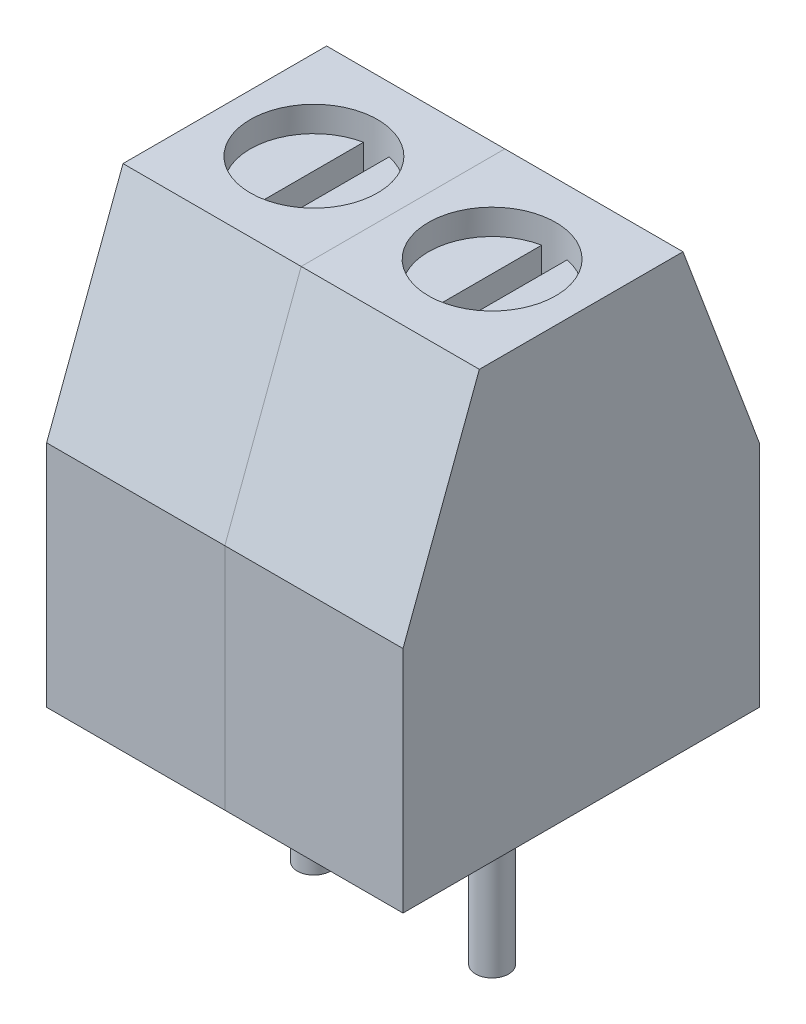
ISO-10303-21;
HEADER;
FILE_DESCRIPTION(('STEP AP214'),'2;1');
FILE_NAME('part.step','',(''),(''),'','','');
FILE_SCHEMA(('AUTOMOTIVE_DESIGN { 1 0 10303 214 1 1 1 1 }'));
ENDSEC;
DATA;
#1=APPLICATION_CONTEXT('core data for automotive mechanical design processes');
#2=APPLICATION_PROTOCOL_DEFINITION('international standard','automotive_design',2000,#1);
#3=PRODUCT_CONTEXT('',#1,'mechanical');
#4=PRODUCT('Part','Part','',(#3));
#5=PRODUCT_RELATED_PRODUCT_CATEGORY('part','',(#4));
#6=PRODUCT_DEFINITION_FORMATION('','',#4);
#7=PRODUCT_DEFINITION_CONTEXT('part definition',#1,'design');
#8=PRODUCT_DEFINITION('design','',#6,#7);
#9=PRODUCT_DEFINITION_SHAPE('','',#8);
#10=(LENGTH_UNIT() NAMED_UNIT(*) SI_UNIT(.MILLI.,.METRE.));
#11=(NAMED_UNIT(*) PLANE_ANGLE_UNIT() SI_UNIT($,.RADIAN.));
#12=(NAMED_UNIT(*) SI_UNIT($,.STERADIAN.) SOLID_ANGLE_UNIT());
#13=UNCERTAINTY_MEASURE_WITH_UNIT(LENGTH_MEASURE(1.E-05),#10,'distance_accuracy_value','');
#14=(GEOMETRIC_REPRESENTATION_CONTEXT(3) GLOBAL_UNCERTAINTY_ASSIGNED_CONTEXT((#13)) GLOBAL_UNIT_ASSIGNED_CONTEXT((#10,
#11,#12)) REPRESENTATION_CONTEXT('',''));
#15=CARTESIAN_POINT('',(0.,0.,0.));
#16=DIRECTION('',(0.,0.,1.));
#17=DIRECTION('',(1.,0.,0.));
#18=AXIS2_PLACEMENT_3D('',#15,#16,#17);
#19=CARTESIAN_POINT('',(5.25,8.,-3.5));
#20=DIRECTION('',(0.,1.,0.));
#21=DIRECTION('',(0.,0.,1.));
#22=AXIS2_PLACEMENT_3D('',#19,#20,#21);
#23=PLANE('',#22);
#24=DIRECTION('',(0.,0.,-1.));
#25=VECTOR('',#24,1.);
#26=CARTESIAN_POINT('',(5.49994995834108,8.,-4.72475508503753));
#27=LINE('',#26,#25);
#28=CARTESIAN_POINT('',(5.49994995834108,8.,-2.27524491496247));
#29=VERTEX_POINT('',#28);
#30=CARTESIAN_POINT('',(5.49994995834108,8.,-4.72475508503753));
#31=VERTEX_POINT('',#30);
#32=EDGE_CURVE('E174',#29,#31,#27,.T.);
#33=ORIENTED_EDGE('',*,*,#32,.F.);
#34=CARTESIAN_POINT('',(5.25,8.,-3.5));
#35=DIRECTION('',(0.,1.,0.));
#36=DIRECTION('',(0.,0.,1.));
#37=AXIS2_PLACEMENT_3D('',#34,#35,#36);
#38=CIRCLE('',#37,1.25);
#39=EDGE_CURVE('E156',#29,#31,#38,.T.);
#40=ORIENTED_EDGE('',*,*,#39,.T.);
#41=EDGE_LOOP('',(#33,#40));
#42=FACE_BOUND('',#41,.T.);
#43=ADVANCED_FACE('F46',(#42),#23,.T.);
#44=CARTESIAN_POINT('',(7.,0.,0.));
#45=DIRECTION('',(0.,0.,-1.));
#46=DIRECTION('',(-1.,0.,0.));
#47=AXIS2_PLACEMENT_3D('',#44,#45,#46);
#48=PLANE('',#47);
#49=DIRECTION('',(0.,-1.,0.));
#50=VECTOR('',#49,1.);
#51=CARTESIAN_POINT('',(3.5,0.,0.));
#52=LINE('',#51,#50);
#53=CARTESIAN_POINT('',(3.5,4.5,0.));
#54=VERTEX_POINT('',#53);
#55=CARTESIAN_POINT('',(3.5,0.,0.));
#56=VERTEX_POINT('',#55);
#57=EDGE_CURVE('E240',#54,#56,#52,.T.);
#58=ORIENTED_EDGE('',*,*,#57,.T.);
#59=DIRECTION('',(-1.,0.,0.));
#60=VECTOR('',#59,1.);
#61=CARTESIAN_POINT('',(7.,0.,0.));
#62=LINE('',#61,#60);
#63=CARTESIAN_POINT('',(7.,0.,0.));
#64=VERTEX_POINT('',#63);
#65=EDGE_CURVE('E54',#64,#56,#62,.T.);
#66=ORIENTED_EDGE('',*,*,#65,.F.);
#67=DIRECTION('',(0.,-1.,0.));
#68=VECTOR('',#67,1.);
#69=CARTESIAN_POINT('',(7.,0.,0.));
#70=LINE('',#69,#68);
#71=CARTESIAN_POINT('',(7.,4.5,0.));
#72=VERTEX_POINT('',#71);
#73=EDGE_CURVE('E230',#72,#64,#70,.T.);
#74=ORIENTED_EDGE('',*,*,#73,.F.);
#75=DIRECTION('',(-1.,0.,0.));
#76=VECTOR('',#75,1.);
#77=CARTESIAN_POINT('',(7.,4.5,0.));
#78=LINE('',#77,#76);
#79=EDGE_CURVE('E224',#72,#54,#78,.T.);
#80=ORIENTED_EDGE('',*,*,#79,.T.);
#81=EDGE_LOOP('',(#58,#66,#74,#80));
#82=FACE_BOUND('',#81,.T.);
#83=ADVANCED_FACE('F48',(#82),#48,.F.);
#84=CARTESIAN_POINT('',(7.,0.,0.));
#85=DIRECTION('',(0.,1.,0.));
#86=DIRECTION('',(0.,0.,1.));
#87=AXIS2_PLACEMENT_3D('',#84,#85,#86);
#88=PLANE('',#87);
#89=CARTESIAN_POINT('',(5.25,0.,-3.5));
#90=DIRECTION('',(0.,1.,0.));
#91=DIRECTION('',(0.,0.,1.));
#92=AXIS2_PLACEMENT_3D('',#89,#90,#91);
#93=CIRCLE('',#92,0.325);
#94=CARTESIAN_POINT('',(5.25,0.,-3.175));
#95=VERTEX_POINT('',#94);
#96=EDGE_CURVE('E12',#95,#95,#93,.F.);
#97=ORIENTED_EDGE('',*,*,#96,.F.);
#98=EDGE_LOOP('',(#97));
#99=FACE_BOUND('',#98,.T.);
#100=DIRECTION('',(0.,0.,-1.));
#101=VECTOR('',#100,1.);
#102=CARTESIAN_POINT('',(3.5,0.,0.));
#103=LINE('',#102,#101);
#104=CARTESIAN_POINT('',(3.5,0.,-7.));
#105=VERTEX_POINT('',#104);
#106=EDGE_CURVE('E238',#56,#105,#103,.T.);
#107=ORIENTED_EDGE('',*,*,#106,.T.);
#108=DIRECTION('',(-1.,0.,0.));
#109=VECTOR('',#108,1.);
#110=CARTESIAN_POINT('',(7.,0.,-7.));
#111=LINE('',#110,#109);
#112=CARTESIAN_POINT('',(7.,0.,-7.));
#113=VERTEX_POINT('',#112);
#114=EDGE_CURVE('E211',#113,#105,#111,.T.);
#115=ORIENTED_EDGE('',*,*,#114,.F.);
#116=DIRECTION('',(0.,0.,-1.));
#117=VECTOR('',#116,1.);
#118=CARTESIAN_POINT('',(7.,0.,0.));
#119=LINE('',#118,#117);
#120=EDGE_CURVE('E251',#64,#113,#119,.T.);
#121=ORIENTED_EDGE('',*,*,#120,.F.);
#122=ORIENTED_EDGE('',*,*,#65,.T.);
#123=EDGE_LOOP('',(#107,#115,#121,#122));
#124=FACE_BOUND('',#123,.T.);
#125=ADVANCED_FACE('F320',(#99,#124),#88,.F.);
#126=CARTESIAN_POINT('',(7.,0.,-7.));
#127=DIRECTION('',(0.,0.,1.));
#128=DIRECTION('',(1.,0.,0.));
#129=AXIS2_PLACEMENT_3D('',#126,#127,#128);
#130=PLANE('',#129);
#131=DIRECTION('',(-1.,0.,0.));
#132=VECTOR('',#131,1.);
#133=CARTESIAN_POINT('',(6.75,0.5,-7.));
#134=LINE('',#133,#132);
#135=CARTESIAN_POINT('',(6.75,0.5,-7.));
#136=VERTEX_POINT('',#135);
#137=CARTESIAN_POINT('',(3.75,0.5,-7.));
#138=VERTEX_POINT('',#137);
#139=EDGE_CURVE('E268',#136,#138,#134,.T.);
#140=ORIENTED_EDGE('',*,*,#139,.F.);
#141=DIRECTION('',(0.,-1.,0.));
#142=VECTOR('',#141,1.);
#143=CARTESIAN_POINT('',(6.75,0.5,-7.));
#144=LINE('',#143,#142);
#145=CARTESIAN_POINT('',(6.75,4.5,-7.));
#146=VERTEX_POINT('',#145);
#147=EDGE_CURVE('E208',#146,#136,#144,.T.);
#148=ORIENTED_EDGE('',*,*,#147,.F.);
#149=DIRECTION('',(-1.,0.,0.));
#150=VECTOR('',#149,1.);
#151=CARTESIAN_POINT('',(7.,4.5,-7.));
#152=LINE('',#151,#150);
#153=CARTESIAN_POINT('',(7.,4.5,-7.));
#154=VERTEX_POINT('',#153);
#155=EDGE_CURVE('E214',#154,#146,#152,.T.);
#156=ORIENTED_EDGE('',*,*,#155,.F.);
#157=DIRECTION('',(0.,1.,0.));
#158=VECTOR('',#157,1.);
#159=CARTESIAN_POINT('',(7.,0.,-7.));
#160=LINE('',#159,#158);
#161=EDGE_CURVE('E249',#113,#154,#160,.T.);
#162=ORIENTED_EDGE('',*,*,#161,.F.);
#163=ORIENTED_EDGE('',*,*,#114,.T.);
#164=DIRECTION('',(0.,1.,0.));
#165=VECTOR('',#164,1.);
#166=CARTESIAN_POINT('',(3.5,0.,-7.));
#167=LINE('',#166,#165);
#168=CARTESIAN_POINT('',(3.5,4.5,-7.));
#169=VERTEX_POINT('',#168);
#170=EDGE_CURVE('E235',#105,#169,#167,.T.);
#171=ORIENTED_EDGE('',*,*,#170,.T.);
#172=CARTESIAN_POINT('',(3.75,4.5,-7.));
#173=VERTEX_POINT('',#172);
#174=EDGE_CURVE('E217',#173,#169,#152,.T.);
#175=ORIENTED_EDGE('',*,*,#174,.F.);
#176=DIRECTION('',(0.,1.,0.));
#177=VECTOR('',#176,1.);
#178=CARTESIAN_POINT('',(3.75,0.5,-7.));
#179=LINE('',#178,#177);
#180=EDGE_CURVE('E69',#138,#173,#179,.T.);
#181=ORIENTED_EDGE('',*,*,#180,.F.);
#182=EDGE_LOOP('',(#140,#148,#156,#162,#163,#171,#175,#181));
#183=FACE_BOUND('',#182,.T.);
#184=ADVANCED_FACE('F318',(#183),#130,.F.);
#185=CARTESIAN_POINT('',(7.,8.5,-5.5));
#186=DIRECTION('',(0.,-0.351123441588392,0.936329177569045));
#187=DIRECTION('',(0.,-0.936329177569045,-0.351123441588392));
#188=AXIS2_PLACEMENT_3D('',#185,#186,#187);
#189=PLANE('',#188);
#190=DIRECTION('',(0.,0.936329177569045,0.351123441588392));
#191=VECTOR('',#190,1.);
#192=CARTESIAN_POINT('',(3.5,8.5,-5.5));
#193=LINE('',#192,#191);
#194=CARTESIAN_POINT('',(3.5,8.5,-5.5));
#195=VERTEX_POINT('',#194);
#196=EDGE_CURVE('E233',#169,#195,#193,.T.);
#197=ORIENTED_EDGE('',*,*,#196,.T.);
#198=DIRECTION('',(-1.,0.,0.));
#199=VECTOR('',#198,1.);
#200=CARTESIAN_POINT('',(7.,8.5,-5.5));
#201=LINE('',#200,#199);
#202=CARTESIAN_POINT('',(7.,8.5,-5.5));
#203=VERTEX_POINT('',#202);
#204=EDGE_CURVE('E218',#203,#195,#201,.T.);
#205=ORIENTED_EDGE('',*,*,#204,.F.);
#206=DIRECTION('',(0.,0.936329177569045,0.351123441588392));
#207=VECTOR('',#206,1.);
#208=CARTESIAN_POINT('',(7.,8.5,-5.5));
#209=LINE('',#208,#207);
#210=EDGE_CURVE('E247',#154,#203,#209,.T.);
#211=ORIENTED_EDGE('',*,*,#210,.F.);
#212=ORIENTED_EDGE('',*,*,#155,.T.);
#213=DIRECTION('',(1.,0.,0.));
#214=VECTOR('',#213,1.);
#215=CARTESIAN_POINT('',(6.75,4.5,-7.));
#216=LINE('',#215,#214);
#217=EDGE_CURVE('E263',#173,#146,#216,.T.);
#218=ORIENTED_EDGE('',*,*,#217,.F.);
#219=ORIENTED_EDGE('',*,*,#174,.T.);
#220=EDGE_LOOP('',(#197,#205,#211,#212,#218,#219));
#221=FACE_BOUND('',#220,.T.);
#222=ADVANCED_FACE('F289',(#221),#189,.F.);
#223=CARTESIAN_POINT('',(7.,8.5,-1.5));
#224=DIRECTION('',(0.,-1.,0.));
#225=DIRECTION('',(0.,0.,-1.));
#226=AXIS2_PLACEMENT_3D('',#223,#224,#225);
#227=PLANE('',#226);
#228=CARTESIAN_POINT('',(5.25,8.5,-3.5));
#229=DIRECTION('',(0.,1.,0.));
#230=DIRECTION('',(0.,0.,1.));
#231=AXIS2_PLACEMENT_3D('',#228,#229,#230);
#232=CIRCLE('',#231,1.25);
#233=CARTESIAN_POINT('',(5.25,8.5,-2.25));
#234=VERTEX_POINT('',#233);
#235=EDGE_CURVE('E194',#234,#234,#232,.T.);
#236=ORIENTED_EDGE('',*,*,#235,.F.);
#237=EDGE_LOOP('',(#236));
#238=FACE_BOUND('',#237,.T.);
#239=DIRECTION('',(0.,0.,1.));
#240=VECTOR('',#239,1.);
#241=CARTESIAN_POINT('',(3.5,8.5,-1.5));
#242=LINE('',#241,#240);
#243=CARTESIAN_POINT('',(3.5,8.5,-1.5));
#244=VERTEX_POINT('',#243);
#245=EDGE_CURVE('E231',#195,#244,#242,.T.);
#246=ORIENTED_EDGE('',*,*,#245,.T.);
#247=DIRECTION('',(-1.,0.,0.));
#248=VECTOR('',#247,1.);
#249=CARTESIAN_POINT('',(7.,8.5,-1.5));
#250=LINE('',#249,#248);
#251=CARTESIAN_POINT('',(7.,8.5,-1.5));
#252=VERTEX_POINT('',#251);
#253=EDGE_CURVE('E221',#252,#244,#250,.T.);
#254=ORIENTED_EDGE('',*,*,#253,.F.);
#255=DIRECTION('',(0.,0.,1.));
#256=VECTOR('',#255,1.);
#257=CARTESIAN_POINT('',(7.,8.5,-1.5));
#258=LINE('',#257,#256);
#259=EDGE_CURVE('E245',#203,#252,#258,.T.);
#260=ORIENTED_EDGE('',*,*,#259,.F.);
#261=ORIENTED_EDGE('',*,*,#204,.T.);
#262=EDGE_LOOP('',(#246,#254,#260,#261));
#263=FACE_BOUND('',#262,.T.);
#264=ADVANCED_FACE('F285',(#238,#263),#227,.F.);
#265=CARTESIAN_POINT('',(7.,8.5,-1.5));
#266=DIRECTION('',(0.,-0.351123441588392,-0.936329177569045));
#267=DIRECTION('',(0.,0.936329177569045,-0.351123441588392));
#268=AXIS2_PLACEMENT_3D('',#265,#266,#267);
#269=PLANE('',#268);
#270=DIRECTION('',(0.,-0.936329177569045,0.351123441588392));
#271=VECTOR('',#270,1.);
#272=CARTESIAN_POINT('',(3.5,8.5,-1.5));
#273=LINE('',#272,#271);
#274=EDGE_CURVE('E228',#244,#54,#273,.T.);
#275=ORIENTED_EDGE('',*,*,#274,.T.);
#276=ORIENTED_EDGE('',*,*,#79,.F.);
#277=DIRECTION('',(0.,-0.936329177569045,0.351123441588392));
#278=VECTOR('',#277,1.);
#279=CARTESIAN_POINT('',(7.,8.5,-1.5));
#280=LINE('',#279,#278);
#281=EDGE_CURVE('E227',#252,#72,#280,.T.);
#282=ORIENTED_EDGE('',*,*,#281,.F.);
#283=ORIENTED_EDGE('',*,*,#253,.T.);
#284=EDGE_LOOP('',(#275,#276,#282,#283));
#285=FACE_BOUND('',#284,.T.);
#286=ADVANCED_FACE('F288',(#285),#269,.F.);
#287=CARTESIAN_POINT('',(7.,0.,0.));
#288=DIRECTION('',(-1.,0.,0.));
#289=DIRECTION('',(0.,0.,1.));
#290=AXIS2_PLACEMENT_3D('',#287,#288,#289);
#291=PLANE('',#290);
#292=ORIENTED_EDGE('',*,*,#73,.T.);
#293=ORIENTED_EDGE('',*,*,#120,.T.);
#294=ORIENTED_EDGE('',*,*,#161,.T.);
#295=ORIENTED_EDGE('',*,*,#210,.T.);
#296=ORIENTED_EDGE('',*,*,#259,.T.);
#297=ORIENTED_EDGE('',*,*,#281,.T.);
#298=EDGE_LOOP('',(#292,#293,#294,#295,#296,#297));
#299=FACE_BOUND('',#298,.T.);
#300=ADVANCED_FACE('F308',(#299),#291,.F.);
#301=CARTESIAN_POINT('',(3.5,0.,0.));
#302=DIRECTION('',(-1.,0.,0.));
#303=DIRECTION('',(0.,0.,1.));
#304=AXIS2_PLACEMENT_3D('',#301,#302,#303);
#305=PLANE('',#304);
#306=ORIENTED_EDGE('',*,*,#57,.F.);
#307=ORIENTED_EDGE('',*,*,#274,.F.);
#308=ORIENTED_EDGE('',*,*,#245,.F.);
#309=ORIENTED_EDGE('',*,*,#196,.F.);
#310=ORIENTED_EDGE('',*,*,#170,.F.);
#311=ORIENTED_EDGE('',*,*,#106,.F.);
#312=EDGE_LOOP('',(#306,#307,#308,#309,#310,#311));
#313=FACE_BOUND('',#312,.T.);
#314=ADVANCED_FACE('F302',(#313),#305,.T.);
#315=CARTESIAN_POINT('',(6.75,0.5,-5.5));
#316=DIRECTION('',(1.,0.,0.));
#317=DIRECTION('',(0.,0.,-1.));
#318=AXIS2_PLACEMENT_3D('',#315,#316,#317);
#319=PLANE('',#318);
#320=ORIENTED_EDGE('',*,*,#147,.T.);
#321=DIRECTION('',(0.,0.,-1.));
#322=VECTOR('',#321,1.);
#323=CARTESIAN_POINT('',(6.75,0.5,-5.5));
#324=LINE('',#323,#322);
#325=CARTESIAN_POINT('',(6.75,0.5,-5.5));
#326=VERTEX_POINT('',#325);
#327=EDGE_CURVE('E255',#326,#136,#324,.T.);
#328=ORIENTED_EDGE('',*,*,#327,.F.);
#329=DIRECTION('',(0.,-1.,0.));
#330=VECTOR('',#329,1.);
#331=CARTESIAN_POINT('',(6.75,0.5,-5.5));
#332=LINE('',#331,#330);
#333=CARTESIAN_POINT('',(6.75,4.5,-5.5));
#334=VERTEX_POINT('',#333);
#335=EDGE_CURVE('E266',#334,#326,#332,.T.);
#336=ORIENTED_EDGE('',*,*,#335,.F.);
#337=DIRECTION('',(0.,0.,-1.));
#338=VECTOR('',#337,1.);
#339=CARTESIAN_POINT('',(6.75,4.5,-5.5));
#340=LINE('',#339,#338);
#341=EDGE_CURVE('E243',#334,#146,#340,.T.);
#342=ORIENTED_EDGE('',*,*,#341,.T.);
#343=EDGE_LOOP('',(#320,#328,#336,#342));
#344=FACE_BOUND('',#343,.T.);
#345=ADVANCED_FACE('F360',(#344),#319,.F.);
#346=CARTESIAN_POINT('',(6.75,4.5,-5.5));
#347=DIRECTION('',(0.,1.,0.));
#348=DIRECTION('',(0.,0.,1.));
#349=AXIS2_PLACEMENT_3D('',#346,#347,#348);
#350=PLANE('',#349);
#351=ORIENTED_EDGE('',*,*,#217,.T.);
#352=ORIENTED_EDGE('',*,*,#341,.F.);
#353=DIRECTION('',(1.,0.,0.));
#354=VECTOR('',#353,1.);
#355=CARTESIAN_POINT('',(6.75,4.5,-5.5));
#356=LINE('',#355,#354);
#357=CARTESIAN_POINT('',(3.75,4.5,-5.5));
#358=VERTEX_POINT('',#357);
#359=EDGE_CURVE('E258',#358,#334,#356,.T.);
#360=ORIENTED_EDGE('',*,*,#359,.F.);
#361=DIRECTION('',(0.,0.,-1.));
#362=VECTOR('',#361,1.);
#363=CARTESIAN_POINT('',(3.75,4.5,-5.5));
#364=LINE('',#363,#362);
#365=EDGE_CURVE('E260',#358,#173,#364,.T.);
#366=ORIENTED_EDGE('',*,*,#365,.T.);
#367=EDGE_LOOP('',(#351,#352,#360,#366));
#368=FACE_BOUND('',#367,.T.);
#369=ADVANCED_FACE('F356',(#368),#350,.F.);
#370=CARTESIAN_POINT('',(3.75,0.5,-5.5));
#371=DIRECTION('',(-1.,0.,0.));
#372=DIRECTION('',(0.,-1.,0.));
#373=AXIS2_PLACEMENT_3D('',#370,#371,#372);
#374=PLANE('',#373);
#375=ORIENTED_EDGE('',*,*,#180,.T.);
#376=ORIENTED_EDGE('',*,*,#365,.F.);
#377=DIRECTION('',(0.,1.,0.));
#378=VECTOR('',#377,1.);
#379=CARTESIAN_POINT('',(3.75,0.5,-5.5));
#380=LINE('',#379,#378);
#381=CARTESIAN_POINT('',(3.75,0.5,-5.5));
#382=VERTEX_POINT('',#381);
#383=EDGE_CURVE('E275',#382,#358,#380,.T.);
#384=ORIENTED_EDGE('',*,*,#383,.F.);
#385=DIRECTION('',(0.,0.,-1.));
#386=VECTOR('',#385,1.);
#387=CARTESIAN_POINT('',(3.75,0.5,-5.5));
#388=LINE('',#387,#386);
#389=EDGE_CURVE('E257',#382,#138,#388,.T.);
#390=ORIENTED_EDGE('',*,*,#389,.T.);
#391=EDGE_LOOP('',(#375,#376,#384,#390));
#392=FACE_BOUND('',#391,.T.);
#393=ADVANCED_FACE('F359',(#392),#374,.F.);
#394=CARTESIAN_POINT('',(6.75,0.5,-5.5));
#395=DIRECTION('',(0.,-1.,0.));
#396=DIRECTION('',(0.,0.,-1.));
#397=AXIS2_PLACEMENT_3D('',#394,#395,#396);
#398=PLANE('',#397);
#399=ORIENTED_EDGE('',*,*,#139,.T.);
#400=ORIENTED_EDGE('',*,*,#389,.F.);
#401=DIRECTION('',(-1.,0.,0.));
#402=VECTOR('',#401,1.);
#403=CARTESIAN_POINT('',(6.75,0.5,-5.5));
#404=LINE('',#403,#402);
#405=EDGE_CURVE('E278',#326,#382,#404,.T.);
#406=ORIENTED_EDGE('',*,*,#405,.F.);
#407=ORIENTED_EDGE('',*,*,#327,.T.);
#408=EDGE_LOOP('',(#399,#400,#406,#407));
#409=FACE_BOUND('',#408,.T.);
#410=ADVANCED_FACE('F352',(#409),#398,.F.);
#411=CARTESIAN_POINT('',(3.5,0.,-5.5));
#412=DIRECTION('',(0.,0.,1.));
#413=DIRECTION('',(1.,0.,0.));
#414=AXIS2_PLACEMENT_3D('',#411,#412,#413);
#415=PLANE('',#414);
#416=CARTESIAN_POINT('',(5.25,2.,-5.5));
#417=DIRECTION('',(0.,0.,-1.));
#418=DIRECTION('',(-1.,0.,0.));
#419=AXIS2_PLACEMENT_3D('',#416,#417,#418);
#420=CIRCLE('',#419,1.);
#421=CARTESIAN_POINT('',(4.25,2.,-5.5));
#422=VERTEX_POINT('',#421);
#423=EDGE_CURVE('E177',#422,#422,#420,.T.);
#424=ORIENTED_EDGE('',*,*,#423,.F.);
#425=EDGE_LOOP('',(#424));
#426=FACE_BOUND('',#425,.T.);
#427=ORIENTED_EDGE('',*,*,#335,.T.);
#428=ORIENTED_EDGE('',*,*,#405,.T.);
#429=ORIENTED_EDGE('',*,*,#383,.T.);
#430=ORIENTED_EDGE('',*,*,#359,.T.);
#431=EDGE_LOOP('',(#427,#428,#429,#430));
#432=FACE_BOUND('',#431,.T.);
#433=ADVANCED_FACE('F345',(#426,#432),#415,.F.);
#434=CARTESIAN_POINT('',(5.25,8.,-3.5));
#435=DIRECTION('',(0.,1.,0.));
#436=DIRECTION('',(0.,0.,1.));
#437=AXIS2_PLACEMENT_3D('',#434,#435,#436);
#438=CYLINDRICAL_SURFACE('',#437,1.25);
#439=ORIENTED_EDGE('',*,*,#39,.F.);
#440=DIRECTION('',(0.,1.,0.));
#441=VECTOR('',#440,1.);
#442=CARTESIAN_POINT('',(5.49994995834108,7.5,-2.27524491496247));
#443=LINE('',#442,#441);
#444=CARTESIAN_POINT('',(5.49994995834108,7.5,-2.27524491496247));
#445=VERTEX_POINT('',#444);
#446=EDGE_CURVE('E148',#445,#29,#443,.T.);
#447=ORIENTED_EDGE('',*,*,#446,.F.);
#448=CARTESIAN_POINT('',(5.25,7.5,-3.5));
#449=DIRECTION('',(0.,1.,0.));
#450=DIRECTION('',(0.,0.,1.));
#451=AXIS2_PLACEMENT_3D('',#448,#449,#450);
#452=CIRCLE('',#451,1.25);
#453=CARTESIAN_POINT('',(5.00005004165892,7.5,-2.27524491496247));
#454=VERTEX_POINT('',#453);
#455=EDGE_CURVE('E153',#454,#445,#452,.T.);
#456=ORIENTED_EDGE('',*,*,#455,.F.);
#457=DIRECTION('',(0.,1.,0.));
#458=VECTOR('',#457,1.);
#459=CARTESIAN_POINT('',(5.00005004165892,7.5,-2.27524491496247));
#460=LINE('',#459,#458);
#461=CARTESIAN_POINT('',(5.00005004165892,8.,-2.27524491496247));
#462=VERTEX_POINT('',#461);
#463=EDGE_CURVE('E192',#454,#462,#460,.T.);
#464=ORIENTED_EDGE('',*,*,#463,.T.);
#465=CARTESIAN_POINT('',(5.00005004165892,8.,-4.72475508503753));
#466=VERTEX_POINT('',#465);
#467=EDGE_CURVE('E201',#466,#462,#38,.T.);
#468=ORIENTED_EDGE('',*,*,#467,.F.);
#469=DIRECTION('',(0.,1.,0.));
#470=VECTOR('',#469,1.);
#471=CARTESIAN_POINT('',(5.00005004165892,7.5,-4.72475508503753));
#472=LINE('',#471,#470);
#473=CARTESIAN_POINT('',(5.00005004165892,7.5,-4.72475508503753));
#474=VERTEX_POINT('',#473);
#475=EDGE_CURVE('E61',#474,#466,#472,.T.);
#476=ORIENTED_EDGE('',*,*,#475,.F.);
#477=CARTESIAN_POINT('',(5.25,7.5,-3.5));
#478=DIRECTION('',(0.,1.,0.));
#479=DIRECTION('',(0.,0.,1.));
#480=AXIS2_PLACEMENT_3D('',#477,#478,#479);
#481=CIRCLE('',#480,1.25);
#482=CARTESIAN_POINT('',(5.49994995834108,7.5,-4.72475508503753));
#483=VERTEX_POINT('',#482);
#484=EDGE_CURVE('E169',#483,#474,#481,.T.);
#485=ORIENTED_EDGE('',*,*,#484,.F.);
#486=DIRECTION('',(0.,1.,0.));
#487=VECTOR('',#486,1.);
#488=CARTESIAN_POINT('',(5.49994995834108,7.5,-4.72475508503753));
#489=LINE('',#488,#487);
#490=EDGE_CURVE('E160',#483,#31,#489,.T.);
#491=ORIENTED_EDGE('',*,*,#490,.T.);
#492=EDGE_LOOP('',(#439,#447,#456,#464,#468,#476,#485,#491));
#493=FACE_BOUND('',#492,.T.);
#494=ORIENTED_EDGE('',*,*,#235,.T.);
#495=EDGE_LOOP('',(#494));
#496=FACE_BOUND('',#495,.T.);
#497=ADVANCED_FACE('F150',(#493,#496),#438,.F.);
#498=DIRECTION('',(0.,0.,1.));
#499=VECTOR('',#498,1.);
#500=CARTESIAN_POINT('',(5.00005004165892,8.,-4.72475508503753));
#501=LINE('',#500,#499);
#502=EDGE_CURVE('E172',#466,#462,#501,.T.);
#503=ORIENTED_EDGE('',*,*,#502,.F.);
#504=ORIENTED_EDGE('',*,*,#467,.T.);
#505=EDGE_LOOP('',(#503,#504));
#506=FACE_BOUND('',#505,.T.);
#507=ADVANCED_FACE('F332',(#506),#23,.T.);
#508=CARTESIAN_POINT('',(5.00005004165892,7.5,-4.72475508503753));
#509=DIRECTION('',(-1.,0.,0.));
#510=DIRECTION('',(0.,0.,1.));
#511=AXIS2_PLACEMENT_3D('',#508,#509,#510);
#512=PLANE('',#511);
#513=ORIENTED_EDGE('',*,*,#502,.T.);
#514=ORIENTED_EDGE('',*,*,#463,.F.);
#515=DIRECTION('',(0.,0.,1.));
#516=VECTOR('',#515,1.);
#517=CARTESIAN_POINT('',(5.00005004165892,7.5,-4.72475508503753));
#518=LINE('',#517,#516);
#519=EDGE_CURVE('E161',#474,#454,#518,.T.);
#520=ORIENTED_EDGE('',*,*,#519,.F.);
#521=ORIENTED_EDGE('',*,*,#475,.T.);
#522=EDGE_LOOP('',(#513,#514,#520,#521));
#523=FACE_BOUND('',#522,.T.);
#524=ADVANCED_FACE('F338',(#523),#512,.F.);
#525=CARTESIAN_POINT('',(5.49994995834108,7.5,-4.72475508503753));
#526=DIRECTION('',(1.,0.,0.));
#527=DIRECTION('',(0.,0.,-1.));
#528=AXIS2_PLACEMENT_3D('',#525,#526,#527);
#529=PLANE('',#528);
#530=ORIENTED_EDGE('',*,*,#32,.T.);
#531=ORIENTED_EDGE('',*,*,#490,.F.);
#532=DIRECTION('',(0.,0.,-1.));
#533=VECTOR('',#532,1.);
#534=CARTESIAN_POINT('',(5.49994995834108,7.5,-4.72475508503753));
#535=LINE('',#534,#533);
#536=EDGE_CURVE('E164',#445,#483,#535,.T.);
#537=ORIENTED_EDGE('',*,*,#536,.F.);
#538=ORIENTED_EDGE('',*,*,#446,.T.);
#539=EDGE_LOOP('',(#530,#531,#537,#538));
#540=FACE_BOUND('',#539,.T.);
#541=ADVANCED_FACE('F165',(#540),#529,.F.);
#542=CARTESIAN_POINT('',(5.25,7.5,-3.5));
#543=DIRECTION('',(0.,1.,0.));
#544=DIRECTION('',(0.,0.,1.));
#545=AXIS2_PLACEMENT_3D('',#542,#543,#544);
#546=PLANE('',#545);
#547=ORIENTED_EDGE('',*,*,#455,.T.);
#548=ORIENTED_EDGE('',*,*,#536,.T.);
#549=ORIENTED_EDGE('',*,*,#484,.T.);
#550=ORIENTED_EDGE('',*,*,#519,.T.);
#551=EDGE_LOOP('',(#547,#548,#549,#550));
#552=FACE_BOUND('',#551,.T.);
#553=ADVANCED_FACE('F171',(#552),#546,.T.);
#554=CARTESIAN_POINT('',(5.25,2.,-2.5));
#555=DIRECTION('',(0.,0.,-1.));
#556=DIRECTION('',(-1.,0.,0.));
#557=AXIS2_PLACEMENT_3D('',#554,#555,#556);
#558=CYLINDRICAL_SURFACE('',#557,1.);
#559=CARTESIAN_POINT('',(5.25,2.,-2.5));
#560=DIRECTION('',(0.,0.,-1.));
#561=DIRECTION('',(-1.,0.,0.));
#562=AXIS2_PLACEMENT_3D('',#559,#560,#561);
#563=CIRCLE('',#562,1.);
#564=CARTESIAN_POINT('',(4.25,2.,-2.5));
#565=VERTEX_POINT('',#564);
#566=EDGE_CURVE('E189',#565,#565,#563,.T.);
#567=ORIENTED_EDGE('',*,*,#566,.F.);
#568=EDGE_LOOP('',(#567));
#569=FACE_BOUND('',#568,.T.);
#570=ORIENTED_EDGE('',*,*,#423,.T.);
#571=EDGE_LOOP('',(#570));
#572=FACE_BOUND('',#571,.T.);
#573=ADVANCED_FACE('F456',(#569,#572),#558,.F.);
#574=CARTESIAN_POINT('',(5.25,2.,-2.5));
#575=DIRECTION('',(0.,0.,-1.));
#576=DIRECTION('',(-1.,0.,0.));
#577=AXIS2_PLACEMENT_3D('',#574,#575,#576);
#578=PLANE('',#577);
#579=ORIENTED_EDGE('',*,*,#566,.T.);
#580=EDGE_LOOP('',(#579));
#581=FACE_BOUND('',#580,.T.);
#582=ADVANCED_FACE('F465',(#581),#578,.T.);
#583=CARTESIAN_POINT('',(5.25,-3.5,-3.5));
#584=DIRECTION('',(0.,1.,0.));
#585=DIRECTION('',(0.,0.,1.));
#586=AXIS2_PLACEMENT_3D('',#583,#584,#585);
#587=CYLINDRICAL_SURFACE('',#586,0.325);
#588=CARTESIAN_POINT('',(5.25,-3.5,-3.5));
#589=DIRECTION('',(0.,-1.,0.));
#590=DIRECTION('',(0.,0.,-1.));
#591=AXIS2_PLACEMENT_3D('',#588,#589,#590);
#592=CIRCLE('',#591,0.325);
#593=CARTESIAN_POINT('',(5.25,-3.5,-3.825));
#594=VERTEX_POINT('',#593);
#595=EDGE_CURVE('E578',#594,#594,#592,.T.);
#596=ORIENTED_EDGE('',*,*,#595,.F.);
#597=EDGE_LOOP('',(#596));
#598=FACE_BOUND('',#597,.T.);
#599=ORIENTED_EDGE('',*,*,#96,.T.);
#600=EDGE_LOOP('',(#599));
#601=FACE_BOUND('',#600,.T.);
#602=ADVANCED_FACE('F475',(#598,#601),#587,.T.);
#603=CARTESIAN_POINT('',(3.5,-3.5,0.));
#604=DIRECTION('',(0.,-1.,0.));
#605=DIRECTION('',(0.,0.,-1.));
#606=AXIS2_PLACEMENT_3D('',#603,#604,#605);
#607=PLANE('',#606);
#608=ORIENTED_EDGE('',*,*,#595,.T.);
#609=EDGE_LOOP('',(#608));
#610=FACE_BOUND('',#609,.T.);
#611=ADVANCED_FACE('F486',(#610),#607,.T.);
#612=CLOSED_SHELL('',(#43,#83,#125,#184,#222,#264,#286,#300,#314,#345,#369,#393,#410,#433,#497,
#507,#524,#541,#553,#573,#582,#602,#611));
#613=MANIFOLD_SOLID_BREP('B2',#612);
#614=CARTESIAN_POINT('',(1.75,8.,-3.5));
#615=DIRECTION('',(0.,1.,0.));
#616=DIRECTION('',(0.,0.,1.));
#617=AXIS2_PLACEMENT_3D('',#614,#615,#616);
#618=PLANE('',#617);
#619=DIRECTION('',(0.,0.,-1.));
#620=VECTOR('',#619,1.);
#621=CARTESIAN_POINT('',(1.99994995834108,8.,-4.72475508503753));
#622=LINE('',#621,#620);
#623=CARTESIAN_POINT('',(1.99994995834108,8.,-2.27524491496247));
#624=VERTEX_POINT('',#623);
#625=CARTESIAN_POINT('',(1.99994995834108,8.,-4.72475508503753));
#626=VERTEX_POINT('',#625);
#627=EDGE_CURVE('E722',#624,#626,#622,.T.);
#628=ORIENTED_EDGE('',*,*,#627,.F.);
#629=CARTESIAN_POINT('',(1.75,8.,-3.5));
#630=DIRECTION('',(0.,1.,0.));
#631=DIRECTION('',(0.,0.,1.));
#632=AXIS2_PLACEMENT_3D('',#629,#630,#631);
#633=CIRCLE('',#632,1.25);
#634=EDGE_CURVE('E704',#624,#626,#633,.T.);
#635=ORIENTED_EDGE('',*,*,#634,.T.);
#636=EDGE_LOOP('',(#628,#635));
#637=FACE_BOUND('',#636,.T.);
#638=ADVANCED_FACE('F594',(#637),#618,.T.);
#639=CARTESIAN_POINT('',(3.5,0.,0.));
#640=DIRECTION('',(0.,0.,-1.));
#641=DIRECTION('',(-1.,0.,0.));
#642=AXIS2_PLACEMENT_3D('',#639,#640,#641);
#643=PLANE('',#642);
#644=DIRECTION('',(0.,-1.,0.));
#645=VECTOR('',#644,1.);
#646=CARTESIAN_POINT('',(0.,0.,0.));
#647=LINE('',#646,#645);
#648=CARTESIAN_POINT('',(0.,4.5,0.));
#649=VERTEX_POINT('',#648);
#650=CARTESIAN_POINT('',(0.,0.,0.));
#651=VERTEX_POINT('',#650);
#652=EDGE_CURVE('E788',#649,#651,#647,.T.);
#653=ORIENTED_EDGE('',*,*,#652,.T.);
#654=DIRECTION('',(-1.,0.,0.));
#655=VECTOR('',#654,1.);
#656=CARTESIAN_POINT('',(3.5,0.,0.));
#657=LINE('',#656,#655);
#658=CARTESIAN_POINT('',(3.5,0.,0.));
#659=VERTEX_POINT('',#658);
#660=EDGE_CURVE('E602',#659,#651,#657,.T.);
#661=ORIENTED_EDGE('',*,*,#660,.F.);
#662=DIRECTION('',(0.,-1.,0.));
#663=VECTOR('',#662,1.);
#664=CARTESIAN_POINT('',(3.5,0.,0.));
#665=LINE('',#664,#663);
#666=CARTESIAN_POINT('',(3.5,4.5,0.));
#667=VERTEX_POINT('',#666);
#668=EDGE_CURVE('E778',#667,#659,#665,.T.);
#669=ORIENTED_EDGE('',*,*,#668,.F.);
#670=DIRECTION('',(-1.,0.,0.));
#671=VECTOR('',#670,1.);
#672=CARTESIAN_POINT('',(3.5,4.5,0.));
#673=LINE('',#672,#671);
#674=EDGE_CURVE('E772',#667,#649,#673,.T.);
#675=ORIENTED_EDGE('',*,*,#674,.T.);
#676=EDGE_LOOP('',(#653,#661,#669,#675));
#677=FACE_BOUND('',#676,.T.);
#678=ADVANCED_FACE('F596',(#677),#643,.F.);
#679=CARTESIAN_POINT('',(3.5,0.,0.));
#680=DIRECTION('',(0.,1.,0.));
#681=DIRECTION('',(0.,0.,1.));
#682=AXIS2_PLACEMENT_3D('',#679,#680,#681);
#683=PLANE('',#682);
#684=CARTESIAN_POINT('',(1.75,0.,-3.5));
#685=DIRECTION('',(0.,1.,0.));
#686=DIRECTION('',(0.,0.,1.));
#687=AXIS2_PLACEMENT_3D('',#684,#685,#686);
#688=CIRCLE('',#687,0.325);
#689=CARTESIAN_POINT('',(1.75,0.,-3.175));
#690=VERTEX_POINT('',#689);
#691=EDGE_CURVE('E44',#690,#690,#688,.F.);
#692=ORIENTED_EDGE('',*,*,#691,.F.);
#693=EDGE_LOOP('',(#692));
#694=FACE_BOUND('',#693,.T.);
#695=DIRECTION('',(0.,0.,-1.));
#696=VECTOR('',#695,1.);
#697=CARTESIAN_POINT('',(0.,0.,0.));
#698=LINE('',#697,#696);
#699=CARTESIAN_POINT('',(0.,0.,-7.));
#700=VERTEX_POINT('',#699);
#701=EDGE_CURVE('E786',#651,#700,#698,.T.);
#702=ORIENTED_EDGE('',*,*,#701,.T.);
#703=DIRECTION('',(-1.,0.,0.));
#704=VECTOR('',#703,1.);
#705=CARTESIAN_POINT('',(3.5,0.,-7.));
#706=LINE('',#705,#704);
#707=CARTESIAN_POINT('',(3.5,0.,-7.));
#708=VERTEX_POINT('',#707);
#709=EDGE_CURVE('E759',#708,#700,#706,.T.);
#710=ORIENTED_EDGE('',*,*,#709,.F.);
#711=DIRECTION('',(0.,0.,-1.));
#712=VECTOR('',#711,1.);
#713=CARTESIAN_POINT('',(3.5,0.,0.));
#714=LINE('',#713,#712);
#715=EDGE_CURVE('E799',#659,#708,#714,.T.);
#716=ORIENTED_EDGE('',*,*,#715,.F.);
#717=ORIENTED_EDGE('',*,*,#660,.T.);
#718=EDGE_LOOP('',(#702,#710,#716,#717));
#719=FACE_BOUND('',#718,.T.);
#720=ADVANCED_FACE('F868',(#694,#719),#683,.F.);
#721=CARTESIAN_POINT('',(3.5,0.,-7.));
#722=DIRECTION('',(0.,0.,1.));
#723=DIRECTION('',(1.,0.,0.));
#724=AXIS2_PLACEMENT_3D('',#721,#722,#723);
#725=PLANE('',#724);
#726=DIRECTION('',(-1.,0.,0.));
#727=VECTOR('',#726,1.);
#728=CARTESIAN_POINT('',(3.25,0.5,-7.));
#729=LINE('',#728,#727);
#730=CARTESIAN_POINT('',(3.25,0.5,-7.));
#731=VERTEX_POINT('',#730);
#732=CARTESIAN_POINT('',(0.25,0.5,-7.));
#733=VERTEX_POINT('',#732);
#734=EDGE_CURVE('E816',#731,#733,#729,.T.);
#735=ORIENTED_EDGE('',*,*,#734,.F.);
#736=DIRECTION('',(0.,-1.,0.));
#737=VECTOR('',#736,1.);
#738=CARTESIAN_POINT('',(3.25,0.5,-7.));
#739=LINE('',#738,#737);
#740=CARTESIAN_POINT('',(3.25,4.5,-7.));
#741=VERTEX_POINT('',#740);
#742=EDGE_CURVE('E756',#741,#731,#739,.T.);
#743=ORIENTED_EDGE('',*,*,#742,.F.);
#744=DIRECTION('',(-1.,0.,0.));
#745=VECTOR('',#744,1.);
#746=CARTESIAN_POINT('',(3.5,4.5,-7.));
#747=LINE('',#746,#745);
#748=CARTESIAN_POINT('',(3.5,4.5,-7.));
#749=VERTEX_POINT('',#748);
#750=EDGE_CURVE('E762',#749,#741,#747,.T.);
#751=ORIENTED_EDGE('',*,*,#750,.F.);
#752=DIRECTION('',(0.,1.,0.));
#753=VECTOR('',#752,1.);
#754=CARTESIAN_POINT('',(3.5,0.,-7.));
#755=LINE('',#754,#753);
#756=EDGE_CURVE('E797',#708,#749,#755,.T.);
#757=ORIENTED_EDGE('',*,*,#756,.F.);
#758=ORIENTED_EDGE('',*,*,#709,.T.);
#759=DIRECTION('',(0.,1.,0.));
#760=VECTOR('',#759,1.);
#761=CARTESIAN_POINT('',(0.,0.,-7.));
#762=LINE('',#761,#760);
#763=CARTESIAN_POINT('',(0.,4.5,-7.));
#764=VERTEX_POINT('',#763);
#765=EDGE_CURVE('E783',#700,#764,#762,.T.);
#766=ORIENTED_EDGE('',*,*,#765,.T.);
#767=CARTESIAN_POINT('',(0.25,4.5,-7.));
#768=VERTEX_POINT('',#767);
#769=EDGE_CURVE('E765',#768,#764,#747,.T.);
#770=ORIENTED_EDGE('',*,*,#769,.F.);
#771=DIRECTION('',(0.,1.,0.));
#772=VECTOR('',#771,1.);
#773=CARTESIAN_POINT('',(0.25,0.5,-7.));
#774=LINE('',#773,#772);
#775=EDGE_CURVE('E617',#733,#768,#774,.T.);
#776=ORIENTED_EDGE('',*,*,#775,.F.);
#777=EDGE_LOOP('',(#735,#743,#751,#757,#758,#766,#770,#776));
#778=FACE_BOUND('',#777,.T.);
#779=ADVANCED_FACE('F866',(#778),#725,.F.);
#780=CARTESIAN_POINT('',(3.5,8.5,-5.5));
#781=DIRECTION('',(0.,-0.351123441588392,0.936329177569045));
#782=DIRECTION('',(0.,-0.936329177569045,-0.351123441588392));
#783=AXIS2_PLACEMENT_3D('',#780,#781,#782);
#784=PLANE('',#783);
#785=DIRECTION('',(0.,0.936329177569045,0.351123441588392));
#786=VECTOR('',#785,1.);
#787=CARTESIAN_POINT('',(0.,8.5,-5.5));
#788=LINE('',#787,#786);
#789=CARTESIAN_POINT('',(0.,8.5,-5.5));
#790=VERTEX_POINT('',#789);
#791=EDGE_CURVE('E781',#764,#790,#788,.T.);
#792=ORIENTED_EDGE('',*,*,#791,.T.);
#793=DIRECTION('',(-1.,0.,0.));
#794=VECTOR('',#793,1.);
#795=CARTESIAN_POINT('',(3.5,8.5,-5.5));
#796=LINE('',#795,#794);
#797=CARTESIAN_POINT('',(3.5,8.5,-5.5));
#798=VERTEX_POINT('',#797);
#799=EDGE_CURVE('E766',#798,#790,#796,.T.);
#800=ORIENTED_EDGE('',*,*,#799,.F.);
#801=DIRECTION('',(0.,0.936329177569045,0.351123441588392));
#802=VECTOR('',#801,1.);
#803=CARTESIAN_POINT('',(3.5,8.5,-5.5));
#804=LINE('',#803,#802);
#805=EDGE_CURVE('E795',#749,#798,#804,.T.);
#806=ORIENTED_EDGE('',*,*,#805,.F.);
#807=ORIENTED_EDGE('',*,*,#750,.T.);
#808=DIRECTION('',(1.,0.,0.));
#809=VECTOR('',#808,1.);
#810=CARTESIAN_POINT('',(3.25,4.5,-7.));
#811=LINE('',#810,#809);
#812=EDGE_CURVE('E811',#768,#741,#811,.T.);
#813=ORIENTED_EDGE('',*,*,#812,.F.);
#814=ORIENTED_EDGE('',*,*,#769,.T.);
#815=EDGE_LOOP('',(#792,#800,#806,#807,#813,#814));
#816=FACE_BOUND('',#815,.T.);
#817=ADVANCED_FACE('F837',(#816),#784,.F.);
#818=CARTESIAN_POINT('',(3.5,8.5,-1.5));
#819=DIRECTION('',(0.,-1.,0.));
#820=DIRECTION('',(0.,0.,-1.));
#821=AXIS2_PLACEMENT_3D('',#818,#819,#820);
#822=PLANE('',#821);
#823=CARTESIAN_POINT('',(1.75,8.5,-3.5));
#824=DIRECTION('',(0.,1.,0.));
#825=DIRECTION('',(0.,0.,1.));
#826=AXIS2_PLACEMENT_3D('',#823,#824,#825);
#827=CIRCLE('',#826,1.25);
#828=CARTESIAN_POINT('',(1.75,8.5,-2.25));
#829=VERTEX_POINT('',#828);
#830=EDGE_CURVE('E742',#829,#829,#827,.T.);
#831=ORIENTED_EDGE('',*,*,#830,.F.);
#832=EDGE_LOOP('',(#831));
#833=FACE_BOUND('',#832,.T.);
#834=DIRECTION('',(0.,0.,1.));
#835=VECTOR('',#834,1.);
#836=CARTESIAN_POINT('',(0.,8.5,-1.5));
#837=LINE('',#836,#835);
#838=CARTESIAN_POINT('',(0.,8.5,-1.5));
#839=VERTEX_POINT('',#838);
#840=EDGE_CURVE('E779',#790,#839,#837,.T.);
#841=ORIENTED_EDGE('',*,*,#840,.T.);
#842=DIRECTION('',(-1.,0.,0.));
#843=VECTOR('',#842,1.);
#844=CARTESIAN_POINT('',(3.5,8.5,-1.5));
#845=LINE('',#844,#843);
#846=CARTESIAN_POINT('',(3.5,8.5,-1.5));
#847=VERTEX_POINT('',#846);
#848=EDGE_CURVE('E769',#847,#839,#845,.T.);
#849=ORIENTED_EDGE('',*,*,#848,.F.);
#850=DIRECTION('',(0.,0.,1.));
#851=VECTOR('',#850,1.);
#852=CARTESIAN_POINT('',(3.5,8.5,-1.5));
#853=LINE('',#852,#851);
#854=EDGE_CURVE('E793',#798,#847,#853,.T.);
#855=ORIENTED_EDGE('',*,*,#854,.F.);
#856=ORIENTED_EDGE('',*,*,#799,.T.);
#857=EDGE_LOOP('',(#841,#849,#855,#856));
#858=FACE_BOUND('',#857,.T.);
#859=ADVANCED_FACE('F833',(#833,#858),#822,.F.);
#860=CARTESIAN_POINT('',(3.5,8.5,-1.5));
#861=DIRECTION('',(0.,-0.351123441588392,-0.936329177569045));
#862=DIRECTION('',(0.,0.936329177569045,-0.351123441588392));
#863=AXIS2_PLACEMENT_3D('',#860,#861,#862);
#864=PLANE('',#863);
#865=DIRECTION('',(0.,-0.936329177569045,0.351123441588392));
#866=VECTOR('',#865,1.);
#867=CARTESIAN_POINT('',(0.,8.5,-1.5));
#868=LINE('',#867,#866);
#869=EDGE_CURVE('E776',#839,#649,#868,.T.);
#870=ORIENTED_EDGE('',*,*,#869,.T.);
#871=ORIENTED_EDGE('',*,*,#674,.F.);
#872=DIRECTION('',(0.,-0.936329177569045,0.351123441588392));
#873=VECTOR('',#872,1.);
#874=CARTESIAN_POINT('',(3.5,8.5,-1.5));
#875=LINE('',#874,#873);
#876=EDGE_CURVE('E775',#847,#667,#875,.T.);
#877=ORIENTED_EDGE('',*,*,#876,.F.);
#878=ORIENTED_EDGE('',*,*,#848,.T.);
#879=EDGE_LOOP('',(#870,#871,#877,#878));
#880=FACE_BOUND('',#879,.T.);
#881=ADVANCED_FACE('F836',(#880),#864,.F.);
#882=CARTESIAN_POINT('',(3.5,0.,0.));
#883=DIRECTION('',(-1.,0.,0.));
#884=DIRECTION('',(0.,0.,1.));
#885=AXIS2_PLACEMENT_3D('',#882,#883,#884);
#886=PLANE('',#885);
#887=ORIENTED_EDGE('',*,*,#668,.T.);
#888=ORIENTED_EDGE('',*,*,#715,.T.);
#889=ORIENTED_EDGE('',*,*,#756,.T.);
#890=ORIENTED_EDGE('',*,*,#805,.T.);
#891=ORIENTED_EDGE('',*,*,#854,.T.);
#892=ORIENTED_EDGE('',*,*,#876,.T.);
#893=EDGE_LOOP('',(#887,#888,#889,#890,#891,#892));
#894=FACE_BOUND('',#893,.T.);
#895=ADVANCED_FACE('F856',(#894),#886,.F.);
#896=CARTESIAN_POINT('',(0.,0.,0.));
#897=DIRECTION('',(-1.,0.,0.));
#898=DIRECTION('',(0.,0.,1.));
#899=AXIS2_PLACEMENT_3D('',#896,#897,#898);
#900=PLANE('',#899);
#901=ORIENTED_EDGE('',*,*,#652,.F.);
#902=ORIENTED_EDGE('',*,*,#869,.F.);
#903=ORIENTED_EDGE('',*,*,#840,.F.);
#904=ORIENTED_EDGE('',*,*,#791,.F.);
#905=ORIENTED_EDGE('',*,*,#765,.F.);
#906=ORIENTED_EDGE('',*,*,#701,.F.);
#907=EDGE_LOOP('',(#901,#902,#903,#904,#905,#906));
#908=FACE_BOUND('',#907,.T.);
#909=ADVANCED_FACE('F850',(#908),#900,.T.);
#910=CARTESIAN_POINT('',(3.25,0.5,-5.5));
#911=DIRECTION('',(1.,0.,0.));
#912=DIRECTION('',(0.,0.,-1.));
#913=AXIS2_PLACEMENT_3D('',#910,#911,#912);
#914=PLANE('',#913);
#915=ORIENTED_EDGE('',*,*,#742,.T.);
#916=DIRECTION('',(0.,0.,-1.));
#917=VECTOR('',#916,1.);
#918=CARTESIAN_POINT('',(3.25,0.5,-5.5));
#919=LINE('',#918,#917);
#920=CARTESIAN_POINT('',(3.25,0.5,-5.5));
#921=VERTEX_POINT('',#920);
#922=EDGE_CURVE('E803',#921,#731,#919,.T.);
#923=ORIENTED_EDGE('',*,*,#922,.F.);
#924=DIRECTION('',(0.,-1.,0.));
#925=VECTOR('',#924,1.);
#926=CARTESIAN_POINT('',(3.25,0.5,-5.5));
#927=LINE('',#926,#925);
#928=CARTESIAN_POINT('',(3.25,4.5,-5.5));
#929=VERTEX_POINT('',#928);
#930=EDGE_CURVE('E814',#929,#921,#927,.T.);
#931=ORIENTED_EDGE('',*,*,#930,.F.);
#932=DIRECTION('',(0.,0.,-1.));
#933=VECTOR('',#932,1.);
#934=CARTESIAN_POINT('',(3.25,4.5,-5.5));
#935=LINE('',#934,#933);
#936=EDGE_CURVE('E791',#929,#741,#935,.T.);
#937=ORIENTED_EDGE('',*,*,#936,.T.);
#938=EDGE_LOOP('',(#915,#923,#931,#937));
#939=FACE_BOUND('',#938,.T.);
#940=ADVANCED_FACE('F908',(#939),#914,.F.);
#941=CARTESIAN_POINT('',(3.25,4.5,-5.5));
#942=DIRECTION('',(0.,1.,0.));
#943=DIRECTION('',(0.,0.,1.));
#944=AXIS2_PLACEMENT_3D('',#941,#942,#943);
#945=PLANE('',#944);
#946=ORIENTED_EDGE('',*,*,#812,.T.);
#947=ORIENTED_EDGE('',*,*,#936,.F.);
#948=DIRECTION('',(1.,0.,0.));
#949=VECTOR('',#948,1.);
#950=CARTESIAN_POINT('',(3.25,4.5,-5.5));
#951=LINE('',#950,#949);
#952=CARTESIAN_POINT('',(0.25,4.5,-5.5));
#953=VERTEX_POINT('',#952);
#954=EDGE_CURVE('E806',#953,#929,#951,.T.);
#955=ORIENTED_EDGE('',*,*,#954,.F.);
#956=DIRECTION('',(0.,0.,-1.));
#957=VECTOR('',#956,1.);
#958=CARTESIAN_POINT('',(0.25,4.5,-5.5));
#959=LINE('',#958,#957);
#960=EDGE_CURVE('E808',#953,#768,#959,.T.);
#961=ORIENTED_EDGE('',*,*,#960,.T.);
#962=EDGE_LOOP('',(#946,#947,#955,#961));
#963=FACE_BOUND('',#962,.T.);
#964=ADVANCED_FACE('F904',(#963),#945,.F.);
#965=CARTESIAN_POINT('',(0.25,0.5,-5.5));
#966=DIRECTION('',(-1.,0.,0.));
#967=DIRECTION('',(0.,-1.,0.));
#968=AXIS2_PLACEMENT_3D('',#965,#966,#967);
#969=PLANE('',#968);
#970=ORIENTED_EDGE('',*,*,#775,.T.);
#971=ORIENTED_EDGE('',*,*,#960,.F.);
#972=DIRECTION('',(0.,1.,0.));
#973=VECTOR('',#972,1.);
#974=CARTESIAN_POINT('',(0.25,0.5,-5.5));
#975=LINE('',#974,#973);
#976=CARTESIAN_POINT('',(0.25,0.5,-5.5));
#977=VERTEX_POINT('',#976);
#978=EDGE_CURVE('E823',#977,#953,#975,.T.);
#979=ORIENTED_EDGE('',*,*,#978,.F.);
#980=DIRECTION('',(0.,0.,-1.));
#981=VECTOR('',#980,1.);
#982=CARTESIAN_POINT('',(0.25,0.5,-5.5));
#983=LINE('',#982,#981);
#984=EDGE_CURVE('E805',#977,#733,#983,.T.);
#985=ORIENTED_EDGE('',*,*,#984,.T.);
#986=EDGE_LOOP('',(#970,#971,#979,#985));
#987=FACE_BOUND('',#986,.T.);
#988=ADVANCED_FACE('F907',(#987),#969,.F.);
#989=CARTESIAN_POINT('',(3.25,0.5,-5.5));
#990=DIRECTION('',(0.,-1.,0.));
#991=DIRECTION('',(0.,0.,-1.));
#992=AXIS2_PLACEMENT_3D('',#989,#990,#991);
#993=PLANE('',#992);
#994=ORIENTED_EDGE('',*,*,#734,.T.);
#995=ORIENTED_EDGE('',*,*,#984,.F.);
#996=DIRECTION('',(-1.,0.,0.));
#997=VECTOR('',#996,1.);
#998=CARTESIAN_POINT('',(3.25,0.5,-5.5));
#999=LINE('',#998,#997);
#1000=EDGE_CURVE('E826',#921,#977,#999,.T.);
#1001=ORIENTED_EDGE('',*,*,#1000,.F.);
#1002=ORIENTED_EDGE('',*,*,#922,.T.);
#1003=EDGE_LOOP('',(#994,#995,#1001,#1002));
#1004=FACE_BOUND('',#1003,.T.);
#1005=ADVANCED_FACE('F900',(#1004),#993,.F.);
#1006=CARTESIAN_POINT('',(0.,0.,-5.5));
#1007=DIRECTION('',(0.,0.,1.));
#1008=DIRECTION('',(1.,0.,0.));
#1009=AXIS2_PLACEMENT_3D('',#1006,#1007,#1008);
#1010=PLANE('',#1009);
#1011=CARTESIAN_POINT('',(1.75,2.,-5.5));
#1012=DIRECTION('',(0.,0.,-1.));
#1013=DIRECTION('',(-1.,0.,0.));
#1014=AXIS2_PLACEMENT_3D('',#1011,#1012,#1013);
#1015=CIRCLE('',#1014,1.);
#1016=CARTESIAN_POINT('',(0.75,2.,-5.5));
#1017=VERTEX_POINT('',#1016);
#1018=EDGE_CURVE('E725',#1017,#1017,#1015,.T.);
#1019=ORIENTED_EDGE('',*,*,#1018,.F.);
#1020=EDGE_LOOP('',(#1019));
#1021=FACE_BOUND('',#1020,.T.);
#1022=ORIENTED_EDGE('',*,*,#930,.T.);
#1023=ORIENTED_EDGE('',*,*,#1000,.T.);
#1024=ORIENTED_EDGE('',*,*,#978,.T.);
#1025=ORIENTED_EDGE('',*,*,#954,.T.);
#1026=EDGE_LOOP('',(#1022,#1023,#1024,#1025));
#1027=FACE_BOUND('',#1026,.T.);
#1028=ADVANCED_FACE('F895',(#1021,#1027),#1010,.F.);
#1029=CARTESIAN_POINT('',(1.75,8.,-3.5));
#1030=DIRECTION('',(0.,1.,0.));
#1031=DIRECTION('',(0.,0.,1.));
#1032=AXIS2_PLACEMENT_3D('',#1029,#1030,#1031);
#1033=CYLINDRICAL_SURFACE('',#1032,1.25);
#1034=ORIENTED_EDGE('',*,*,#634,.F.);
#1035=DIRECTION('',(0.,1.,0.));
#1036=VECTOR('',#1035,1.);
#1037=CARTESIAN_POINT('',(1.99994995834108,7.5,-2.27524491496247));
#1038=LINE('',#1037,#1036);
#1039=CARTESIAN_POINT('',(1.99994995834108,7.5,-2.27524491496247));
#1040=VERTEX_POINT('',#1039);
#1041=EDGE_CURVE('E696',#1040,#624,#1038,.T.);
#1042=ORIENTED_EDGE('',*,*,#1041,.F.);
#1043=CARTESIAN_POINT('',(1.75,7.5,-3.5));
#1044=DIRECTION('',(0.,1.,0.));
#1045=DIRECTION('',(0.,0.,1.));
#1046=AXIS2_PLACEMENT_3D('',#1043,#1044,#1045);
#1047=CIRCLE('',#1046,1.25);
#1048=CARTESIAN_POINT('',(1.50005004165892,7.5,-2.27524491496247));
#1049=VERTEX_POINT('',#1048);
#1050=EDGE_CURVE('E701',#1049,#1040,#1047,.T.);
#1051=ORIENTED_EDGE('',*,*,#1050,.F.);
#1052=DIRECTION('',(0.,1.,0.));
#1053=VECTOR('',#1052,1.);
#1054=CARTESIAN_POINT('',(1.50005004165892,7.5,-2.27524491496247));
#1055=LINE('',#1054,#1053);
#1056=CARTESIAN_POINT('',(1.50005004165892,8.,-2.27524491496247));
#1057=VERTEX_POINT('',#1056);
#1058=EDGE_CURVE('E740',#1049,#1057,#1055,.T.);
#1059=ORIENTED_EDGE('',*,*,#1058,.T.);
#1060=CARTESIAN_POINT('',(1.50005004165892,8.,-4.72475508503753));
#1061=VERTEX_POINT('',#1060);
#1062=EDGE_CURVE('E749',#1061,#1057,#633,.T.);
#1063=ORIENTED_EDGE('',*,*,#1062,.F.);
#1064=DIRECTION('',(0.,1.,0.));
#1065=VECTOR('',#1064,1.);
#1066=CARTESIAN_POINT('',(1.50005004165892,7.5,-4.72475508503753));
#1067=LINE('',#1066,#1065);
#1068=CARTESIAN_POINT('',(1.50005004165892,7.5,-4.72475508503753));
#1069=VERTEX_POINT('',#1068);
#1070=EDGE_CURVE('E609',#1069,#1061,#1067,.T.);
#1071=ORIENTED_EDGE('',*,*,#1070,.F.);
#1072=CARTESIAN_POINT('',(1.75,7.5,-3.5));
#1073=DIRECTION('',(0.,1.,0.));
#1074=DIRECTION('',(0.,0.,1.));
#1075=AXIS2_PLACEMENT_3D('',#1072,#1073,#1074);
#1076=CIRCLE('',#1075,1.25);
#1077=CARTESIAN_POINT('',(1.99994995834108,7.5,-4.72475508503753));
#1078=VERTEX_POINT('',#1077);
#1079=EDGE_CURVE('E717',#1078,#1069,#1076,.T.);
#1080=ORIENTED_EDGE('',*,*,#1079,.F.);
#1081=DIRECTION('',(0.,1.,0.));
#1082=VECTOR('',#1081,1.);
#1083=CARTESIAN_POINT('',(1.99994995834108,7.5,-4.72475508503753));
#1084=LINE('',#1083,#1082);
#1085=EDGE_CURVE('E708',#1078,#626,#1084,.T.);
#1086=ORIENTED_EDGE('',*,*,#1085,.T.);
#1087=EDGE_LOOP('',(#1034,#1042,#1051,#1059,#1063,#1071,#1080,#1086));
#1088=FACE_BOUND('',#1087,.T.);
#1089=ORIENTED_EDGE('',*,*,#830,.T.);
#1090=EDGE_LOOP('',(#1089));
#1091=FACE_BOUND('',#1090,.T.);
#1092=ADVANCED_FACE('F698',(#1088,#1091),#1033,.F.);
#1093=DIRECTION('',(0.,0.,1.));
#1094=VECTOR('',#1093,1.);
#1095=CARTESIAN_POINT('',(1.50005004165892,8.,-4.72475508503753));
#1096=LINE('',#1095,#1094);
#1097=EDGE_CURVE('E720',#1061,#1057,#1096,.T.);
#1098=ORIENTED_EDGE('',*,*,#1097,.F.);
#1099=ORIENTED_EDGE('',*,*,#1062,.T.);
#1100=EDGE_LOOP('',(#1098,#1099));
#1101=FACE_BOUND('',#1100,.T.);
#1102=ADVANCED_FACE('F882',(#1101),#618,.T.);
#1103=CARTESIAN_POINT('',(1.50005004165892,7.5,-4.72475508503753));
#1104=DIRECTION('',(-1.,0.,0.));
#1105=DIRECTION('',(0.,0.,1.));
#1106=AXIS2_PLACEMENT_3D('',#1103,#1104,#1105);
#1107=PLANE('',#1106);
#1108=ORIENTED_EDGE('',*,*,#1097,.T.);
#1109=ORIENTED_EDGE('',*,*,#1058,.F.);
#1110=DIRECTION('',(0.,0.,1.));
#1111=VECTOR('',#1110,1.);
#1112=CARTESIAN_POINT('',(1.50005004165892,7.5,-4.72475508503753));
#1113=LINE('',#1112,#1111);
#1114=EDGE_CURVE('E709',#1069,#1049,#1113,.T.);
#1115=ORIENTED_EDGE('',*,*,#1114,.F.);
#1116=ORIENTED_EDGE('',*,*,#1070,.T.);
#1117=EDGE_LOOP('',(#1108,#1109,#1115,#1116));
#1118=FACE_BOUND('',#1117,.T.);
#1119=ADVANCED_FACE('F888',(#1118),#1107,.F.);
#1120=CARTESIAN_POINT('',(1.99994995834108,7.5,-4.72475508503753));
#1121=DIRECTION('',(1.,0.,0.));
#1122=DIRECTION('',(0.,0.,-1.));
#1123=AXIS2_PLACEMENT_3D('',#1120,#1121,#1122);
#1124=PLANE('',#1123);
#1125=ORIENTED_EDGE('',*,*,#627,.T.);
#1126=ORIENTED_EDGE('',*,*,#1085,.F.);
#1127=DIRECTION('',(0.,0.,-1.));
#1128=VECTOR('',#1127,1.);
#1129=CARTESIAN_POINT('',(1.99994995834108,7.5,-4.72475508503753));
#1130=LINE('',#1129,#1128);
#1131=EDGE_CURVE('E712',#1040,#1078,#1130,.T.);
#1132=ORIENTED_EDGE('',*,*,#1131,.F.);
#1133=ORIENTED_EDGE('',*,*,#1041,.T.);
#1134=EDGE_LOOP('',(#1125,#1126,#1132,#1133));
#1135=FACE_BOUND('',#1134,.T.);
#1136=ADVANCED_FACE('F713',(#1135),#1124,.F.);
#1137=CARTESIAN_POINT('',(1.75,7.5,-3.5));
#1138=DIRECTION('',(0.,1.,0.));
#1139=DIRECTION('',(0.,0.,1.));
#1140=AXIS2_PLACEMENT_3D('',#1137,#1138,#1139);
#1141=PLANE('',#1140);
#1142=ORIENTED_EDGE('',*,*,#1050,.T.);
#1143=ORIENTED_EDGE('',*,*,#1131,.T.);
#1144=ORIENTED_EDGE('',*,*,#1079,.T.);
#1145=ORIENTED_EDGE('',*,*,#1114,.T.);
#1146=EDGE_LOOP('',(#1142,#1143,#1144,#1145));
#1147=FACE_BOUND('',#1146,.T.);
#1148=ADVANCED_FACE('F719',(#1147),#1141,.T.);
#1149=CARTESIAN_POINT('',(1.75,2.,-2.5));
#1150=DIRECTION('',(0.,0.,-1.));
#1151=DIRECTION('',(-1.,0.,0.));
#1152=AXIS2_PLACEMENT_3D('',#1149,#1150,#1151);
#1153=CYLINDRICAL_SURFACE('',#1152,1.);
#1154=CARTESIAN_POINT('',(1.75,2.,-2.5));
#1155=DIRECTION('',(0.,0.,-1.));
#1156=DIRECTION('',(-1.,0.,0.));
#1157=AXIS2_PLACEMENT_3D('',#1154,#1155,#1156);
#1158=CIRCLE('',#1157,1.);
#1159=CARTESIAN_POINT('',(0.75,2.,-2.5));
#1160=VERTEX_POINT('',#1159);
#1161=EDGE_CURVE('E737',#1160,#1160,#1158,.T.);
#1162=ORIENTED_EDGE('',*,*,#1161,.F.);
#1163=EDGE_LOOP('',(#1162));
#1164=FACE_BOUND('',#1163,.T.);
#1165=ORIENTED_EDGE('',*,*,#1018,.T.);
#1166=EDGE_LOOP('',(#1165));
#1167=FACE_BOUND('',#1166,.T.);
#1168=ADVANCED_FACE('F975',(#1164,#1167),#1153,.F.);
#1169=CARTESIAN_POINT('',(1.75,2.,-2.5));
#1170=DIRECTION('',(0.,0.,-1.));
#1171=DIRECTION('',(-1.,0.,0.));
#1172=AXIS2_PLACEMENT_3D('',#1169,#1170,#1171);
#1173=PLANE('',#1172);
#1174=ORIENTED_EDGE('',*,*,#1161,.T.);
#1175=EDGE_LOOP('',(#1174));
#1176=FACE_BOUND('',#1175,.T.);
#1177=ADVANCED_FACE('F990',(#1176),#1173,.T.);
#1178=CARTESIAN_POINT('',(1.75,-3.5,-3.5));
#1179=DIRECTION('',(0.,1.,0.));
#1180=DIRECTION('',(0.,0.,1.));
#1181=AXIS2_PLACEMENT_3D('',#1178,#1179,#1180);
#1182=CYLINDRICAL_SURFACE('',#1181,0.325);
#1183=CARTESIAN_POINT('',(1.75,-3.5,-3.5));
#1184=DIRECTION('',(0.,-1.,0.));
#1185=DIRECTION('',(0.,0.,-1.));
#1186=AXIS2_PLACEMENT_3D('',#1183,#1184,#1185);
#1187=CIRCLE('',#1186,0.325);
#1188=CARTESIAN_POINT('',(1.75,-3.5,-3.825));
#1189=VERTEX_POINT('',#1188);
#1190=EDGE_CURVE('E1070',#1189,#1189,#1187,.T.);
#1191=ORIENTED_EDGE('',*,*,#1190,.F.);
#1192=EDGE_LOOP('',(#1191));
#1193=FACE_BOUND('',#1192,.T.);
#1194=ORIENTED_EDGE('',*,*,#691,.T.);
#1195=EDGE_LOOP('',(#1194));
#1196=FACE_BOUND('',#1195,.T.);
#1197=ADVANCED_FACE('F1046',(#1193,#1196),#1182,.T.);
#1198=CARTESIAN_POINT('',(0.,-3.5,0.));
#1199=DIRECTION('',(0.,-1.,0.));
#1200=DIRECTION('',(0.,0.,-1.));
#1201=AXIS2_PLACEMENT_3D('',#1198,#1199,#1200);
#1202=PLANE('',#1201);
#1203=ORIENTED_EDGE('',*,*,#1190,.T.);
#1204=EDGE_LOOP('',(#1203));
#1205=FACE_BOUND('',#1204,.T.);
#1206=ADVANCED_FACE('F1054',(#1205),#1202,.T.);
#1207=CLOSED_SHELL('',(#638,#678,#720,#779,#817,#859,#881,#895,#909,#940,#964,#988,#1005,#1028,
#1092,#1102,#1119,#1136,#1148,#1168,#1177,#1197,#1206));
#1208=MANIFOLD_SOLID_BREP('B6',#1207);
#1209=ADVANCED_BREP_SHAPE_REPRESENTATION('',(#18,#613,#1208),#14);
#1210=SHAPE_DEFINITION_REPRESENTATION(#9,#1209);
ENDSEC;
END-ISO-10303-21;
